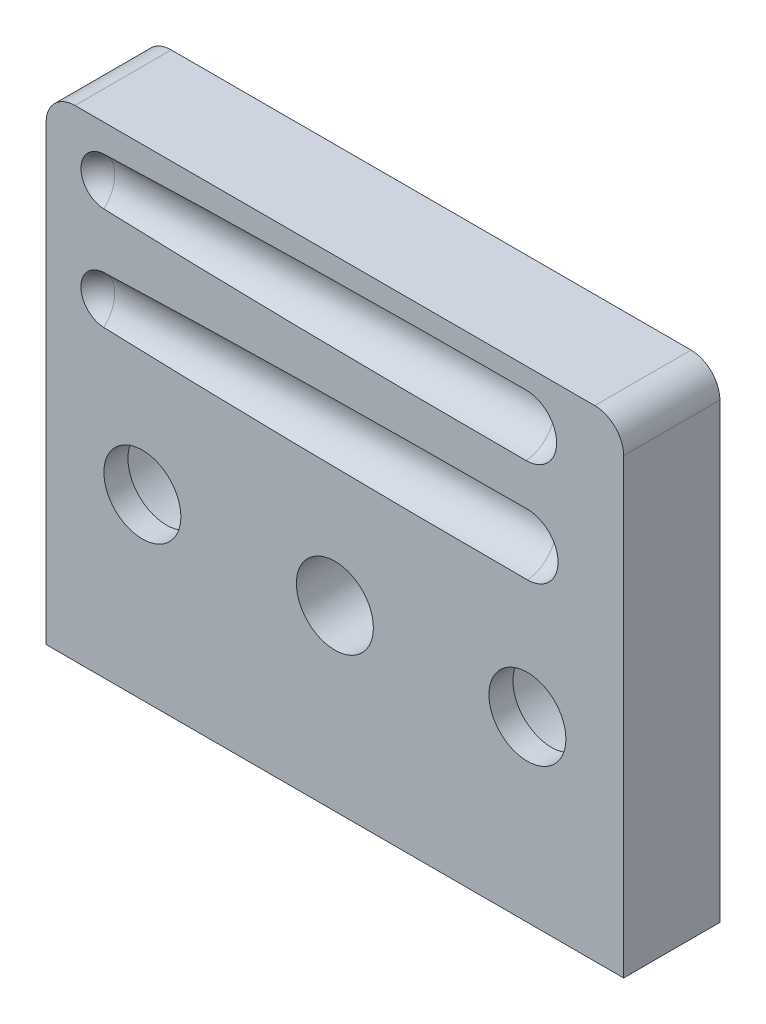
ISO-10303-21;
HEADER;
FILE_DESCRIPTION(('STEP AP214'),'2;1');
FILE_NAME('part.step','',(''),(''),'','','');
FILE_SCHEMA(('AUTOMOTIVE_DESIGN { 1 0 10303 214 1 1 1 1 }'));
ENDSEC;
DATA;
#1=APPLICATION_CONTEXT('core data for automotive mechanical design processes');
#2=APPLICATION_PROTOCOL_DEFINITION('international standard','automotive_design',2000,#1);
#3=PRODUCT_CONTEXT('',#1,'mechanical');
#4=PRODUCT('Part','Part','',(#3));
#5=PRODUCT_RELATED_PRODUCT_CATEGORY('part','',(#4));
#6=PRODUCT_DEFINITION_FORMATION('','',#4);
#7=PRODUCT_DEFINITION_CONTEXT('part definition',#1,'design');
#8=PRODUCT_DEFINITION('design','',#6,#7);
#9=PRODUCT_DEFINITION_SHAPE('','',#8);
#10=(LENGTH_UNIT() NAMED_UNIT(*) SI_UNIT(.MILLI.,.METRE.));
#11=(NAMED_UNIT(*) PLANE_ANGLE_UNIT() SI_UNIT($,.RADIAN.));
#12=(NAMED_UNIT(*) SI_UNIT($,.STERADIAN.) SOLID_ANGLE_UNIT());
#13=UNCERTAINTY_MEASURE_WITH_UNIT(LENGTH_MEASURE(1.E-05),#10,'distance_accuracy_value','');
#14=(GEOMETRIC_REPRESENTATION_CONTEXT(3) GLOBAL_UNCERTAINTY_ASSIGNED_CONTEXT((#13)) GLOBAL_UNIT_ASSIGNED_CONTEXT((#10,
#11,#12)) REPRESENTATION_CONTEXT('',''));
#15=CARTESIAN_POINT('',(0.,0.,0.));
#16=DIRECTION('',(0.,0.,1.));
#17=DIRECTION('',(1.,0.,0.));
#18=AXIS2_PLACEMENT_3D('',#15,#16,#17);
#19=CARTESIAN_POINT('',(0.,0.,0.));
#20=DIRECTION('',(0.,0.,1.));
#21=DIRECTION('',(1.,0.,0.));
#22=AXIS2_PLACEMENT_3D('',#19,#20,#21);
#23=CYLINDRICAL_SURFACE('',#22,4.);
#24=CARTESIAN_POINT('',(0.,0.,10.));
#25=DIRECTION('',(0.,0.,1.));
#26=DIRECTION('',(1.,0.,0.));
#27=AXIS2_PLACEMENT_3D('',#24,#25,#26);
#28=CIRCLE('',#27,4.);
#29=CARTESIAN_POINT('',(4.00000000000001,0.,10.));
#30=VERTEX_POINT('',#29);
#31=EDGE_CURVE('E158',#30,#30,#28,.T.);
#32=ORIENTED_EDGE('',*,*,#31,.T.);
#33=EDGE_LOOP('',(#32));
#34=FACE_BOUND('',#33,.T.);
#35=CARTESIAN_POINT('',(0.,0.,4.));
#36=DIRECTION('',(0.,0.,-1.));
#37=DIRECTION('',(-1.,0.,0.));
#38=AXIS2_PLACEMENT_3D('',#35,#36,#37);
#39=CIRCLE('',#38,4.);
#40=CARTESIAN_POINT('',(-3.99999999999999,0.,4.));
#41=VERTEX_POINT('',#40);
#42=EDGE_CURVE('E37',#41,#41,#39,.F.);
#43=ORIENTED_EDGE('',*,*,#42,.F.);
#44=EDGE_LOOP('',(#43));
#45=FACE_BOUND('',#44,.T.);
#46=ADVANCED_FACE('F33',(#34,#45),#23,.F.);
#47=CARTESIAN_POINT('',(-20.,0.,0.));
#48=DIRECTION('',(0.,0.,1.));
#49=DIRECTION('',(1.,0.,0.));
#50=AXIS2_PLACEMENT_3D('',#47,#48,#49);
#51=CYLINDRICAL_SURFACE('',#50,4.);
#52=CARTESIAN_POINT('',(-20.,0.,10.));
#53=DIRECTION('',(0.,0.,1.));
#54=DIRECTION('',(1.,0.,0.));
#55=AXIS2_PLACEMENT_3D('',#52,#53,#54);
#56=CIRCLE('',#55,4.);
#57=CARTESIAN_POINT('',(-16.,0.,10.));
#58=VERTEX_POINT('',#57);
#59=EDGE_CURVE('E161',#58,#58,#56,.T.);
#60=ORIENTED_EDGE('',*,*,#59,.T.);
#61=EDGE_LOOP('',(#60));
#62=FACE_BOUND('',#61,.T.);
#63=CARTESIAN_POINT('',(-20.,0.,7.5));
#64=DIRECTION('',(0.,0.,-1.));
#65=DIRECTION('',(-1.,0.,0.));
#66=AXIS2_PLACEMENT_3D('',#63,#64,#65);
#67=CIRCLE('',#66,4.);
#68=CARTESIAN_POINT('',(-24.,0.,7.5));
#69=VERTEX_POINT('',#68);
#70=EDGE_CURVE('E131',#69,#69,#67,.F.);
#71=ORIENTED_EDGE('',*,*,#70,.F.);
#72=EDGE_LOOP('',(#71));
#73=FACE_BOUND('',#72,.T.);
#74=ADVANCED_FACE('F239',(#62,#73),#51,.F.);
#75=CARTESIAN_POINT('',(20.,0.,0.));
#76=DIRECTION('',(0.,0.,1.));
#77=DIRECTION('',(1.,0.,0.));
#78=AXIS2_PLACEMENT_3D('',#75,#76,#77);
#79=CYLINDRICAL_SURFACE('',#78,4.);
#80=CARTESIAN_POINT('',(20.,0.,10.));
#81=DIRECTION('',(0.,0.,1.));
#82=DIRECTION('',(1.,0.,0.));
#83=AXIS2_PLACEMENT_3D('',#80,#81,#82);
#84=CIRCLE('',#83,4.);
#85=CARTESIAN_POINT('',(24.,0.,10.));
#86=VERTEX_POINT('',#85);
#87=EDGE_CURVE('E155',#86,#86,#84,.T.);
#88=ORIENTED_EDGE('',*,*,#87,.T.);
#89=EDGE_LOOP('',(#88));
#90=FACE_BOUND('',#89,.T.);
#91=CARTESIAN_POINT('',(20.,0.,7.5));
#92=DIRECTION('',(0.,0.,-1.));
#93=DIRECTION('',(-1.,0.,0.));
#94=AXIS2_PLACEMENT_3D('',#91,#92,#93);
#95=CIRCLE('',#94,4.);
#96=CARTESIAN_POINT('',(16.,0.,7.5));
#97=VERTEX_POINT('',#96);
#98=EDGE_CURVE('E128',#97,#97,#95,.F.);
#99=ORIENTED_EDGE('',*,*,#98,.F.);
#100=EDGE_LOOP('',(#99));
#101=FACE_BOUND('',#100,.T.);
#102=ADVANCED_FACE('F245',(#90,#101),#79,.F.);
#103=CARTESIAN_POINT('',(-30.,-18.5,10.));
#104=DIRECTION('',(0.,0.,-1.));
#105=DIRECTION('',(-1.,0.,0.));
#106=AXIS2_PLACEMENT_3D('',#103,#104,#105);
#107=PLANE('',#106);
#108=CARTESIAN_POINT('',(-23.9094567695513,15.5,10.));
#109=DIRECTION('',(0.,0.,-1.));
#110=DIRECTION('',(-1.,0.,0.));
#111=AXIS2_PLACEMENT_3D('',#108,#109,#110);
#112=CIRCLE('',#111,2.47723554326987);
#113=CARTESIAN_POINT('',(-24.,17.9755803077782,10.));
#114=VERTEX_POINT('',#113);
#115=CARTESIAN_POINT('',(-24.,13.0244196922218,10.));
#116=VERTEX_POINT('',#115);
#117=EDGE_CURVE('E42',#114,#116,#112,.F.);
#118=ORIENTED_EDGE('',*,*,#117,.F.);
#119=CARTESIAN_POINT('',(20.,15.5,10.));
#120=DIRECTION('',(0.,0.,-1.));
#121=DIRECTION('',(-1.,0.,0.));
#122=AXIS2_PLACEMENT_3D('',#119,#120,#121);
#123=ELLIPSE('',#122,70.1012021284653,3.18);
#124=CARTESIAN_POINT('',(20.0000000000001,18.68,10.));
#125=VERTEX_POINT('',#124);
#126=EDGE_CURVE('E11',#114,#125,#123,.T.);
#127=ORIENTED_EDGE('',*,*,#126,.T.);
#128=CARTESIAN_POINT('',(20.,15.5000000000001,10.));
#129=DIRECTION('',(0.,0.,-1.));
#130=DIRECTION('',(-1.,0.,0.));
#131=AXIS2_PLACEMENT_3D('',#128,#129,#130);
#132=CIRCLE('',#131,3.18000000000003);
#133=CARTESIAN_POINT('',(20.,12.32,10.));
#134=VERTEX_POINT('',#133);
#135=EDGE_CURVE('E113',#125,#134,#132,.T.);
#136=ORIENTED_EDGE('',*,*,#135,.T.);
#137=EDGE_CURVE('E44',#134,#116,#123,.T.);
#138=ORIENTED_EDGE('',*,*,#137,.T.);
#139=EDGE_LOOP('',(#118,#127,#136,#138));
#140=FACE_BOUND('',#139,.T.);
#141=DIRECTION('',(-1.,0.,0.));
#142=VECTOR('',#141,1.);
#143=CARTESIAN_POINT('',(30.,31.5,10.));
#144=LINE('',#143,#142);
#145=CARTESIAN_POINT('',(27.,31.5,10.));
#146=VERTEX_POINT('',#145);
#147=CARTESIAN_POINT('',(-27.,31.5,10.));
#148=VERTEX_POINT('',#147);
#149=EDGE_CURVE('E178',#146,#148,#144,.T.);
#150=ORIENTED_EDGE('',*,*,#149,.T.);
#151=CARTESIAN_POINT('',(-27.,28.5,10.));
#152=DIRECTION('',(0.,0.,-1.));
#153=DIRECTION('',(-1.,0.,0.));
#154=AXIS2_PLACEMENT_3D('',#151,#152,#153);
#155=CIRCLE('',#154,3.);
#156=CARTESIAN_POINT('',(-30.,28.5,10.));
#157=VERTEX_POINT('',#156);
#158=EDGE_CURVE('E205',#148,#157,#155,.F.);
#159=ORIENTED_EDGE('',*,*,#158,.T.);
#160=DIRECTION('',(0.,1.,0.));
#161=VECTOR('',#160,1.);
#162=CARTESIAN_POINT('',(-30.,-18.5,10.));
#163=LINE('',#162,#161);
#164=CARTESIAN_POINT('',(-30.,-18.5,10.));
#165=VERTEX_POINT('',#164);
#166=EDGE_CURVE('E175',#165,#157,#163,.T.);
#167=ORIENTED_EDGE('',*,*,#166,.F.);
#168=DIRECTION('',(1.,0.,0.));
#169=VECTOR('',#168,1.);
#170=CARTESIAN_POINT('',(-30.,-18.5,10.));
#171=LINE('',#170,#169);
#172=CARTESIAN_POINT('',(30.,-18.5,10.));
#173=VERTEX_POINT('',#172);
#174=EDGE_CURVE('E183',#165,#173,#171,.T.);
#175=ORIENTED_EDGE('',*,*,#174,.T.);
#176=DIRECTION('',(0.,-1.,0.));
#177=VECTOR('',#176,1.);
#178=CARTESIAN_POINT('',(30.,31.5,10.));
#179=LINE('',#178,#177);
#180=CARTESIAN_POINT('',(30.,28.5,10.));
#181=VERTEX_POINT('',#180);
#182=EDGE_CURVE('E181',#181,#173,#179,.T.);
#183=ORIENTED_EDGE('',*,*,#182,.F.);
#184=CARTESIAN_POINT('',(27.,28.5,10.));
#185=DIRECTION('',(0.,0.,-1.));
#186=DIRECTION('',(-1.,0.,0.));
#187=AXIS2_PLACEMENT_3D('',#184,#185,#186);
#188=CIRCLE('',#187,3.);
#189=EDGE_CURVE('E203',#181,#146,#188,.F.);
#190=ORIENTED_EDGE('',*,*,#189,.T.);
#191=EDGE_LOOP('',(#150,#159,#167,#175,#183,#190));
#192=FACE_BOUND('',#191,.T.);
#193=ORIENTED_EDGE('',*,*,#59,.F.);
#194=EDGE_LOOP('',(#193));
#195=FACE_BOUND('',#194,.T.);
#196=ORIENTED_EDGE('',*,*,#31,.F.);
#197=EDGE_LOOP('',(#196));
#198=FACE_BOUND('',#197,.T.);
#199=ORIENTED_EDGE('',*,*,#87,.F.);
#200=EDGE_LOOP('',(#199));
#201=FACE_BOUND('',#200,.T.);
#202=CARTESIAN_POINT('',(-23.9094567695513,26.1607408574086,10.));
#203=DIRECTION('',(0.,0.,-1.));
#204=DIRECTION('',(-1.,0.,0.));
#205=AXIS2_PLACEMENT_3D('',#202,#203,#204);
#206=CIRCLE('',#205,2.47081382075611);
#207=CARTESIAN_POINT('',(-24.,28.6298951377766,10.));
#208=VERTEX_POINT('',#207);
#209=CARTESIAN_POINT('',(-24.,23.6915865770407,10.));
#210=VERTEX_POINT('',#209);
#211=EDGE_CURVE('E216',#208,#210,#206,.F.);
#212=ORIENTED_EDGE('',*,*,#211,.F.);
#213=CARTESIAN_POINT('',(20.,26.1607408574086,10.));
#214=DIRECTION('',(0.,0.,-1.));
#215=DIRECTION('',(-1.,0.,0.));
#216=AXIS2_PLACEMENT_3D('',#213,#214,#215);
#217=ELLIPSE('',#216,69.9909801125401,3.175);
#218=CARTESIAN_POINT('',(19.8611442993639,29.3357346091724,10.));
#219=VERTEX_POINT('',#218);
#220=EDGE_CURVE('E215',#208,#219,#217,.T.);
#221=ORIENTED_EDGE('',*,*,#220,.T.);
#222=CARTESIAN_POINT('',(19.8614300367208,26.1607408574086,10.));
#223=DIRECTION('',(0.,0.,-1.));
#224=DIRECTION('',(-1.,0.,0.));
#225=AXIS2_PLACEMENT_3D('',#222,#223,#224);
#226=CIRCLE('',#225,3.17499376462143);
#227=CARTESIAN_POINT('',(19.8611442993639,22.9857471056448,10.));
#228=VERTEX_POINT('',#227);
#229=EDGE_CURVE('E209',#219,#228,#226,.T.);
#230=ORIENTED_EDGE('',*,*,#229,.T.);
#231=EDGE_CURVE('E212',#228,#210,#217,.T.);
#232=ORIENTED_EDGE('',*,*,#231,.T.);
#233=EDGE_LOOP('',(#212,#221,#230,#232));
#234=FACE_BOUND('',#233,.T.);
#235=ADVANCED_FACE('F123',(#140,#192,#195,#198,#201,#234),#107,.F.);
#236=CARTESIAN_POINT('',(-30.,-18.5,10.));
#237=DIRECTION('',(-1.,0.,0.));
#238=DIRECTION('',(0.,0.,1.));
#239=AXIS2_PLACEMENT_3D('',#236,#237,#238);
#240=PLANE('',#239);
#241=ORIENTED_EDGE('',*,*,#166,.T.);
#242=DIRECTION('',(0.,0.,-1.));
#243=VECTOR('',#242,1.);
#244=CARTESIAN_POINT('',(-30.,28.5,10.));
#245=LINE('',#244,#243);
#246=CARTESIAN_POINT('',(-30.,28.5,0.));
#247=VERTEX_POINT('',#246);
#248=EDGE_CURVE('E191',#157,#247,#245,.T.);
#249=ORIENTED_EDGE('',*,*,#248,.T.);
#250=DIRECTION('',(0.,1.,0.));
#251=VECTOR('',#250,1.);
#252=CARTESIAN_POINT('',(-30.,-18.5,0.));
#253=LINE('',#252,#251);
#254=CARTESIAN_POINT('',(-30.,-18.5,0.));
#255=VERTEX_POINT('',#254);
#256=EDGE_CURVE('E164',#255,#247,#253,.T.);
#257=ORIENTED_EDGE('',*,*,#256,.F.);
#258=DIRECTION('',(0.,0.,-1.));
#259=VECTOR('',#258,1.);
#260=CARTESIAN_POINT('',(-30.,-18.5,10.));
#261=LINE('',#260,#259);
#262=EDGE_CURVE('E189',#165,#255,#261,.T.);
#263=ORIENTED_EDGE('',*,*,#262,.F.);
#264=EDGE_LOOP('',(#241,#249,#257,#263));
#265=FACE_BOUND('',#264,.T.);
#266=ADVANCED_FACE('F260',(#265),#240,.T.);
#267=CARTESIAN_POINT('',(-30.,-18.5,10.));
#268=DIRECTION('',(0.,1.,0.));
#269=DIRECTION('',(0.,0.,1.));
#270=AXIS2_PLACEMENT_3D('',#267,#268,#269);
#271=PLANE('',#270);
#272=DIRECTION('',(0.,0.,-1.));
#273=VECTOR('',#272,1.);
#274=CARTESIAN_POINT('',(30.,-18.5,10.));
#275=LINE('',#274,#273);
#276=CARTESIAN_POINT('',(30.,-18.5,0.));
#277=VERTEX_POINT('',#276);
#278=EDGE_CURVE('E186',#173,#277,#275,.T.);
#279=ORIENTED_EDGE('',*,*,#278,.F.);
#280=ORIENTED_EDGE('',*,*,#174,.F.);
#281=ORIENTED_EDGE('',*,*,#262,.T.);
#282=DIRECTION('',(1.,0.,0.));
#283=VECTOR('',#282,1.);
#284=CARTESIAN_POINT('',(-30.,-18.5,0.));
#285=LINE('',#284,#283);
#286=EDGE_CURVE('E172',#255,#277,#285,.T.);
#287=ORIENTED_EDGE('',*,*,#286,.T.);
#288=EDGE_LOOP('',(#279,#280,#281,#287));
#289=FACE_BOUND('',#288,.T.);
#290=ADVANCED_FACE('F35',(#289),#271,.F.);
#291=CARTESIAN_POINT('',(30.,31.5,10.));
#292=DIRECTION('',(1.,0.,0.));
#293=DIRECTION('',(0.,0.,-1.));
#294=AXIS2_PLACEMENT_3D('',#291,#292,#293);
#295=PLANE('',#294);
#296=DIRECTION('',(0.,-1.,0.));
#297=VECTOR('',#296,1.);
#298=CARTESIAN_POINT('',(30.,31.5,0.));
#299=LINE('',#298,#297);
#300=CARTESIAN_POINT('',(30.,28.5,0.));
#301=VERTEX_POINT('',#300);
#302=EDGE_CURVE('E170',#301,#277,#299,.T.);
#303=ORIENTED_EDGE('',*,*,#302,.F.);
#304=DIRECTION('',(0.,0.,-1.));
#305=VECTOR('',#304,1.);
#306=CARTESIAN_POINT('',(30.,28.5,10.));
#307=LINE('',#306,#305);
#308=EDGE_CURVE('E207',#301,#181,#307,.F.);
#309=ORIENTED_EDGE('',*,*,#308,.T.);
#310=ORIENTED_EDGE('',*,*,#182,.T.);
#311=ORIENTED_EDGE('',*,*,#278,.T.);
#312=EDGE_LOOP('',(#303,#309,#310,#311));
#313=FACE_BOUND('',#312,.T.);
#314=ADVANCED_FACE('F265',(#313),#295,.T.);
#315=CARTESIAN_POINT('',(30.,31.5,10.));
#316=DIRECTION('',(0.,-1.,0.));
#317=DIRECTION('',(1.,0.,0.));
#318=AXIS2_PLACEMENT_3D('',#315,#316,#317);
#319=PLANE('',#318);
#320=DIRECTION('',(-1.,0.,0.));
#321=VECTOR('',#320,1.);
#322=CARTESIAN_POINT('',(30.,31.5,0.));
#323=LINE('',#322,#321);
#324=CARTESIAN_POINT('',(27.,31.5,0.));
#325=VERTEX_POINT('',#324);
#326=CARTESIAN_POINT('',(-27.,31.5,0.));
#327=VERTEX_POINT('',#326);
#328=EDGE_CURVE('E167',#325,#327,#323,.T.);
#329=ORIENTED_EDGE('',*,*,#328,.T.);
#330=DIRECTION('',(0.,0.,-1.));
#331=VECTOR('',#330,1.);
#332=CARTESIAN_POINT('',(-27.,31.5,10.));
#333=LINE('',#332,#331);
#334=EDGE_CURVE('E201',#327,#148,#333,.F.);
#335=ORIENTED_EDGE('',*,*,#334,.T.);
#336=ORIENTED_EDGE('',*,*,#149,.F.);
#337=DIRECTION('',(0.,0.,-1.));
#338=VECTOR('',#337,1.);
#339=CARTESIAN_POINT('',(27.,31.5,10.));
#340=LINE('',#339,#338);
#341=EDGE_CURVE('E198',#146,#325,#340,.T.);
#342=ORIENTED_EDGE('',*,*,#341,.T.);
#343=EDGE_LOOP('',(#329,#335,#336,#342));
#344=FACE_BOUND('',#343,.T.);
#345=ADVANCED_FACE('F256',(#344),#319,.F.);
#346=CARTESIAN_POINT('',(-30.,-18.5,0.));
#347=DIRECTION('',(0.,0.,-1.));
#348=DIRECTION('',(-1.,0.,0.));
#349=AXIS2_PLACEMENT_3D('',#346,#347,#348);
#350=PLANE('',#349);
#351=CARTESIAN_POINT('',(0.,0.,0.));
#352=DIRECTION('',(0.,0.,-1.));
#353=DIRECTION('',(-1.,0.,0.));
#354=AXIS2_PLACEMENT_3D('',#351,#352,#353);
#355=CIRCLE('',#354,6.75);
#356=CARTESIAN_POINT('',(-6.74999999999999,0.,0.));
#357=VERTEX_POINT('',#356);
#358=EDGE_CURVE('E397',#357,#357,#355,.T.);
#359=ORIENTED_EDGE('',*,*,#358,.F.);
#360=EDGE_LOOP('',(#359));
#361=FACE_BOUND('',#360,.T.);
#362=CARTESIAN_POINT('',(-20.,0.,0.));
#363=DIRECTION('',(0.,0.,-1.));
#364=DIRECTION('',(-1.,0.,0.));
#365=AXIS2_PLACEMENT_3D('',#362,#363,#364);
#366=CIRCLE('',#365,6.75);
#367=CARTESIAN_POINT('',(-26.75,0.,0.));
#368=VERTEX_POINT('',#367);
#369=EDGE_CURVE('E140',#368,#368,#366,.T.);
#370=ORIENTED_EDGE('',*,*,#369,.F.);
#371=EDGE_LOOP('',(#370));
#372=FACE_BOUND('',#371,.T.);
#373=CARTESIAN_POINT('',(20.,0.,0.));
#374=DIRECTION('',(0.,0.,-1.));
#375=DIRECTION('',(-1.,0.,0.));
#376=AXIS2_PLACEMENT_3D('',#373,#374,#375);
#377=CIRCLE('',#376,6.75);
#378=CARTESIAN_POINT('',(13.25,0.,0.));
#379=VERTEX_POINT('',#378);
#380=EDGE_CURVE('E133',#379,#379,#377,.T.);
#381=ORIENTED_EDGE('',*,*,#380,.F.);
#382=EDGE_LOOP('',(#381));
#383=FACE_BOUND('',#382,.T.);
#384=ORIENTED_EDGE('',*,*,#256,.T.);
#385=CARTESIAN_POINT('',(-27.,28.5,0.));
#386=DIRECTION('',(0.,0.,-1.));
#387=DIRECTION('',(-1.,0.,0.));
#388=AXIS2_PLACEMENT_3D('',#385,#386,#387);
#389=CIRCLE('',#388,3.);
#390=EDGE_CURVE('E196',#247,#327,#389,.T.);
#391=ORIENTED_EDGE('',*,*,#390,.T.);
#392=ORIENTED_EDGE('',*,*,#328,.F.);
#393=CARTESIAN_POINT('',(27.,28.5,0.));
#394=DIRECTION('',(0.,0.,-1.));
#395=DIRECTION('',(-1.,0.,0.));
#396=AXIS2_PLACEMENT_3D('',#393,#394,#395);
#397=CIRCLE('',#396,3.);
#398=EDGE_CURVE('E194',#325,#301,#397,.T.);
#399=ORIENTED_EDGE('',*,*,#398,.T.);
#400=ORIENTED_EDGE('',*,*,#302,.T.);
#401=ORIENTED_EDGE('',*,*,#286,.F.);
#402=EDGE_LOOP('',(#384,#391,#392,#399,#400,#401));
#403=FACE_BOUND('',#402,.T.);
#404=ADVANCED_FACE('F252',(#361,#372,#383,#403),#350,.T.);
#405=CARTESIAN_POINT('',(-27.,28.5,10.));
#406=DIRECTION('',(0.,0.,1.));
#407=DIRECTION('',(1.,0.,0.));
#408=AXIS2_PLACEMENT_3D('',#405,#406,#407);
#409=CYLINDRICAL_SURFACE('',#408,3.);
#410=ORIENTED_EDGE('',*,*,#158,.F.);
#411=ORIENTED_EDGE('',*,*,#334,.F.);
#412=ORIENTED_EDGE('',*,*,#390,.F.);
#413=ORIENTED_EDGE('',*,*,#248,.F.);
#414=EDGE_LOOP('',(#410,#411,#412,#413));
#415=FACE_BOUND('',#414,.T.);
#416=ADVANCED_FACE('F234',(#415),#409,.T.);
#417=CARTESIAN_POINT('',(27.,28.5,10.));
#418=DIRECTION('',(0.,0.,1.));
#419=DIRECTION('',(1.,0.,0.));
#420=AXIS2_PLACEMENT_3D('',#417,#418,#419);
#421=CYLINDRICAL_SURFACE('',#420,3.);
#422=ORIENTED_EDGE('',*,*,#189,.F.);
#423=ORIENTED_EDGE('',*,*,#308,.F.);
#424=ORIENTED_EDGE('',*,*,#398,.F.);
#425=ORIENTED_EDGE('',*,*,#341,.F.);
#426=EDGE_LOOP('',(#422,#423,#424,#425));
#427=FACE_BOUND('',#426,.T.);
#428=ADVANCED_FACE('F226',(#427),#421,.T.);
#429=CARTESIAN_POINT('',(-23.9094567695513,26.1607408574086,11.9939167643512));
#430=DIRECTION('',(0.,0.,1.));
#431=DIRECTION('',(1.,0.,0.));
#432=AXIS2_PLACEMENT_3D('',#429,#430,#431);
#433=SPHERICAL_SURFACE('',#432,3.17500000000001);
#434=ORIENTED_EDGE('',*,*,#211,.T.);
#435=CARTESIAN_POINT('',(-23.9094567695513,26.1607408574086,11.9939167643512));
#436=DIRECTION('',(-0.998970569790715,0.,0.0453629881292539));
#437=DIRECTION('',(0.0453629881292539,0.,0.998970569790715));
#438=AXIS2_PLACEMENT_3D('',#435,#436,#437);
#439=CIRCLE('',#438,3.175);
#440=EDGE_CURVE('E152',#208,#210,#439,.T.);
#441=ORIENTED_EDGE('',*,*,#440,.F.);
#442=EDGE_LOOP('',(#434,#441));
#443=FACE_BOUND('',#442,.T.);
#444=ADVANCED_FACE('F224',(#443),#433,.F.);
#445=CARTESIAN_POINT('',(-32.4717098882644,26.1607408574086,12.382726403323));
#446=DIRECTION('',(-0.998970569790715,0.,0.0453629881292539));
#447=DIRECTION('',(0.0453629881292539,0.,0.998970569790715));
#448=AXIS2_PLACEMENT_3D('',#445,#446,#447);
#449=CYLINDRICAL_SURFACE('',#448,3.175);
#450=ORIENTED_EDGE('',*,*,#440,.T.);
#451=ORIENTED_EDGE('',*,*,#231,.F.);
#452=CARTESIAN_POINT('',(19.8614300367208,26.1607408574086,10.0062924252119));
#453=DIRECTION('',(-0.998970569790715,0.,0.0453629881292539));
#454=DIRECTION('',(0.0453629881292539,0.,0.998970569790715));
#455=AXIS2_PLACEMENT_3D('',#452,#453,#454);
#456=CIRCLE('',#455,3.175);
#457=EDGE_CURVE('E58',#219,#228,#456,.T.);
#458=ORIENTED_EDGE('',*,*,#457,.F.);
#459=ORIENTED_EDGE('',*,*,#220,.F.);
#460=EDGE_LOOP('',(#450,#451,#458,#459));
#461=FACE_BOUND('',#460,.T.);
#462=ADVANCED_FACE('F223',(#461),#449,.F.);
#463=CARTESIAN_POINT('',(19.8614300367208,26.1607408574086,10.0062924252119));
#464=DIRECTION('',(0.,0.,1.));
#465=DIRECTION('',(1.,0.,0.));
#466=AXIS2_PLACEMENT_3D('',#463,#464,#465);
#467=SPHERICAL_SURFACE('',#466,3.175);
#468=ORIENTED_EDGE('',*,*,#457,.T.);
#469=ORIENTED_EDGE('',*,*,#229,.F.);
#470=EDGE_LOOP('',(#468,#469));
#471=FACE_BOUND('',#470,.T.);
#472=ADVANCED_FACE('F232',(#471),#467,.F.);
#473=CARTESIAN_POINT('',(-23.9094567695513,15.5,11.9939167643512));
#474=DIRECTION('',(0.,0.,1.));
#475=DIRECTION('',(1.,0.,0.));
#476=AXIS2_PLACEMENT_3D('',#473,#474,#475);
#477=SPHERICAL_SURFACE('',#476,3.18000000000003);
#478=ORIENTED_EDGE('',*,*,#117,.T.);
#479=CARTESIAN_POINT('',(-23.9094567695513,15.5,11.9939167643512));
#480=DIRECTION('',(-0.998970569790715,0.,0.0453629881292539));
#481=DIRECTION('',(0.0453629881292539,0.,0.998970569790715));
#482=AXIS2_PLACEMENT_3D('',#479,#480,#481);
#483=CIRCLE('',#482,3.18);
#484=EDGE_CURVE('E51',#114,#116,#483,.T.);
#485=ORIENTED_EDGE('',*,*,#484,.F.);
#486=EDGE_LOOP('',(#478,#485));
#487=FACE_BOUND('',#486,.T.);
#488=ADVANCED_FACE('F319',(#487),#477,.F.);
#489=CARTESIAN_POINT('',(20.,15.5000000000001,10.));
#490=DIRECTION('',(0.,0.,1.));
#491=DIRECTION('',(1.,0.,0.));
#492=AXIS2_PLACEMENT_3D('',#489,#490,#491);
#493=SPHERICAL_SURFACE('',#492,3.18000000000003);
#494=CARTESIAN_POINT('',(20.0000000000001,15.5,10.));
#495=DIRECTION('',(-0.998970569790715,0.,0.0453629881292539));
#496=DIRECTION('',(0.0453629881292539,0.,0.998970569790715));
#497=AXIS2_PLACEMENT_3D('',#494,#495,#496);
#498=CIRCLE('',#497,3.18);
#499=EDGE_CURVE('E116',#125,#134,#498,.T.);
#500=ORIENTED_EDGE('',*,*,#499,.T.);
#501=ORIENTED_EDGE('',*,*,#135,.F.);
#502=EDGE_LOOP('',(#500,#501));
#503=FACE_BOUND('',#502,.T.);
#504=ADVANCED_FACE('F115',(#503),#493,.F.);
#505=CARTESIAN_POINT('',(-33.4706804580551,15.5,12.4280893914523));
#506=DIRECTION('',(-0.998970569790715,0.,0.0453629881292539));
#507=DIRECTION('',(0.0453629881292539,0.,0.998970569790715));
#508=AXIS2_PLACEMENT_3D('',#505,#506,#507);
#509=CYLINDRICAL_SURFACE('',#508,3.18);
#510=ORIENTED_EDGE('',*,*,#484,.T.);
#511=ORIENTED_EDGE('',*,*,#137,.F.);
#512=ORIENTED_EDGE('',*,*,#499,.F.);
#513=ORIENTED_EDGE('',*,*,#126,.F.);
#514=EDGE_LOOP('',(#510,#511,#512,#513));
#515=FACE_BOUND('',#514,.T.);
#516=ADVANCED_FACE('F120',(#515),#509,.F.);
#517=CARTESIAN_POINT('',(20.,0.,7.5));
#518=DIRECTION('',(0.,0.,-1.));
#519=DIRECTION('',(-1.,0.,0.));
#520=AXIS2_PLACEMENT_3D('',#517,#518,#519);
#521=PLANE('',#520);
#522=CARTESIAN_POINT('',(20.,0.,7.5));
#523=DIRECTION('',(0.,0.,-1.));
#524=DIRECTION('',(-1.,0.,0.));
#525=AXIS2_PLACEMENT_3D('',#522,#523,#524);
#526=CIRCLE('',#525,6.75);
#527=CARTESIAN_POINT('',(13.25,0.,7.5));
#528=VERTEX_POINT('',#527);
#529=EDGE_CURVE('E130',#528,#528,#526,.T.);
#530=ORIENTED_EDGE('',*,*,#529,.T.);
#531=EDGE_LOOP('',(#530));
#532=FACE_BOUND('',#531,.T.);
#533=ORIENTED_EDGE('',*,*,#98,.T.);
#534=EDGE_LOOP('',(#533));
#535=FACE_BOUND('',#534,.T.);
#536=ADVANCED_FACE('F300',(#532,#535),#521,.T.);
#537=CARTESIAN_POINT('',(20.,0.,7.5));
#538=DIRECTION('',(0.,0.,-1.));
#539=DIRECTION('',(-1.,0.,0.));
#540=AXIS2_PLACEMENT_3D('',#537,#538,#539);
#541=CYLINDRICAL_SURFACE('',#540,6.75);
#542=ORIENTED_EDGE('',*,*,#529,.F.);
#543=EDGE_LOOP('',(#542));
#544=FACE_BOUND('',#543,.T.);
#545=ORIENTED_EDGE('',*,*,#380,.T.);
#546=EDGE_LOOP('',(#545));
#547=FACE_BOUND('',#546,.T.);
#548=ADVANCED_FACE('F302',(#544,#547),#541,.F.);
#549=CARTESIAN_POINT('',(-20.,0.,7.5));
#550=DIRECTION('',(0.,0.,-1.));
#551=DIRECTION('',(-1.,0.,0.));
#552=AXIS2_PLACEMENT_3D('',#549,#550,#551);
#553=PLANE('',#552);
#554=CARTESIAN_POINT('',(-20.,0.,7.5));
#555=DIRECTION('',(0.,0.,-1.));
#556=DIRECTION('',(-1.,0.,0.));
#557=AXIS2_PLACEMENT_3D('',#554,#555,#556);
#558=CIRCLE('',#557,6.75);
#559=CARTESIAN_POINT('',(-26.75,0.,7.5));
#560=VERTEX_POINT('',#559);
#561=EDGE_CURVE('E134',#560,#560,#558,.T.);
#562=ORIENTED_EDGE('',*,*,#561,.T.);
#563=EDGE_LOOP('',(#562));
#564=FACE_BOUND('',#563,.T.);
#565=ORIENTED_EDGE('',*,*,#70,.T.);
#566=EDGE_LOOP('',(#565));
#567=FACE_BOUND('',#566,.T.);
#568=ADVANCED_FACE('F309',(#564,#567),#553,.T.);
#569=CARTESIAN_POINT('',(-20.,0.,7.5));
#570=DIRECTION('',(0.,0.,-1.));
#571=DIRECTION('',(-1.,0.,0.));
#572=AXIS2_PLACEMENT_3D('',#569,#570,#571);
#573=CYLINDRICAL_SURFACE('',#572,6.75);
#574=ORIENTED_EDGE('',*,*,#561,.F.);
#575=EDGE_LOOP('',(#574));
#576=FACE_BOUND('',#575,.T.);
#577=ORIENTED_EDGE('',*,*,#369,.T.);
#578=EDGE_LOOP('',(#577));
#579=FACE_BOUND('',#578,.T.);
#580=ADVANCED_FACE('F314',(#576,#579),#573,.F.);
#581=CARTESIAN_POINT('',(0.,0.,4.));
#582=DIRECTION('',(0.,0.,-1.));
#583=DIRECTION('',(-1.,0.,0.));
#584=AXIS2_PLACEMENT_3D('',#581,#582,#583);
#585=PLANE('',#584);
#586=CARTESIAN_POINT('',(0.,0.,4.));
#587=DIRECTION('',(0.,0.,-1.));
#588=DIRECTION('',(-1.,0.,0.));
#589=AXIS2_PLACEMENT_3D('',#586,#587,#588);
#590=CIRCLE('',#589,6.75);
#591=CARTESIAN_POINT('',(-6.74999999999999,0.,4.));
#592=VERTEX_POINT('',#591);
#593=EDGE_CURVE('E394',#592,#592,#590,.T.);
#594=ORIENTED_EDGE('',*,*,#593,.T.);
#595=EDGE_LOOP('',(#594));
#596=FACE_BOUND('',#595,.T.);
#597=ORIENTED_EDGE('',*,*,#42,.T.);
#598=EDGE_LOOP('',(#597));
#599=FACE_BOUND('',#598,.T.);
#600=ADVANCED_FACE('F367',(#596,#599),#585,.T.);
#601=CARTESIAN_POINT('',(0.,0.,4.));
#602=DIRECTION('',(0.,0.,-1.));
#603=DIRECTION('',(-1.,0.,0.));
#604=AXIS2_PLACEMENT_3D('',#601,#602,#603);
#605=CYLINDRICAL_SURFACE('',#604,6.75);
#606=ORIENTED_EDGE('',*,*,#593,.F.);
#607=EDGE_LOOP('',(#606));
#608=FACE_BOUND('',#607,.T.);
#609=ORIENTED_EDGE('',*,*,#358,.T.);
#610=EDGE_LOOP('',(#609));
#611=FACE_BOUND('',#610,.T.);
#612=ADVANCED_FACE('F377',(#608,#611),#605,.F.);
#613=CLOSED_SHELL('',(#46,#74,#102,#235,#266,#290,#314,#345,#404,#416,#428,#444,#462,#472,#488,
#504,#516,#536,#548,#568,#580,#600,#612));
#614=MANIFOLD_SOLID_BREP('B2',#613);
#615=ADVANCED_BREP_SHAPE_REPRESENTATION('',(#18,#614),#14);
#616=SHAPE_DEFINITION_REPRESENTATION(#9,#615);
ENDSEC;
END-ISO-10303-21;
